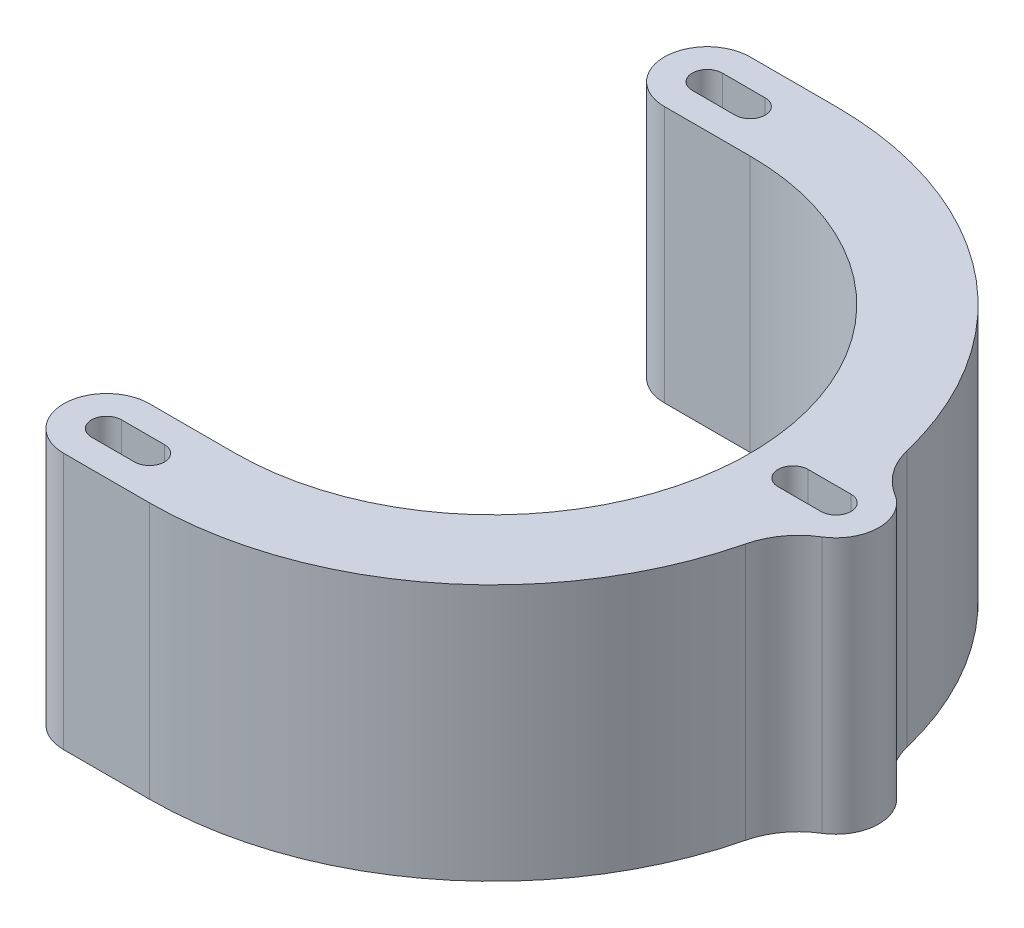
ISO-10303-21;
HEADER;
FILE_DESCRIPTION(('STEP AP214'),'2;1');
FILE_NAME('part.step','',(''),(''),'','','');
FILE_SCHEMA(('AUTOMOTIVE_DESIGN { 1 0 10303 214 1 1 1 1 }'));
ENDSEC;
DATA;
#1=APPLICATION_CONTEXT('core data for automotive mechanical design processes');
#2=APPLICATION_PROTOCOL_DEFINITION('international standard','automotive_design',2000,#1);
#3=PRODUCT_CONTEXT('',#1,'mechanical');
#4=PRODUCT('Part','Part','',(#3));
#5=PRODUCT_RELATED_PRODUCT_CATEGORY('part','',(#4));
#6=PRODUCT_DEFINITION_FORMATION('','',#4);
#7=PRODUCT_DEFINITION_CONTEXT('part definition',#1,'design');
#8=PRODUCT_DEFINITION('design','',#6,#7);
#9=PRODUCT_DEFINITION_SHAPE('','',#8);
#10=(LENGTH_UNIT() NAMED_UNIT(*) SI_UNIT(.MILLI.,.METRE.));
#11=(NAMED_UNIT(*) PLANE_ANGLE_UNIT() SI_UNIT($,.RADIAN.));
#12=(NAMED_UNIT(*) SI_UNIT($,.STERADIAN.) SOLID_ANGLE_UNIT());
#13=UNCERTAINTY_MEASURE_WITH_UNIT(LENGTH_MEASURE(1.E-05),#10,'distance_accuracy_value','');
#14=(GEOMETRIC_REPRESENTATION_CONTEXT(3) GLOBAL_UNCERTAINTY_ASSIGNED_CONTEXT((#13)) GLOBAL_UNIT_ASSIGNED_CONTEXT((#10,
#11,#12)) REPRESENTATION_CONTEXT('',''));
#15=CARTESIAN_POINT('',(0.,0.,0.));
#16=DIRECTION('',(0.,0.,1.));
#17=DIRECTION('',(1.,0.,0.));
#18=AXIS2_PLACEMENT_3D('',#15,#16,#17);
#19=CARTESIAN_POINT('',(56.375,35.9,13.6330251595161));
#20=DIRECTION('',(0.,-1.,0.));
#21=DIRECTION('',(0.,0.,-1.));
#22=AXIS2_PLACEMENT_3D('',#19,#20,#21);
#23=PLANE('',#22);
#24=CARTESIAN_POINT('',(48.,35.9,0.));
#25=DIRECTION('',(0.,1.,0.));
#26=DIRECTION('',(0.,0.,1.));
#27=AXIS2_PLACEMENT_3D('',#24,#25,#26);
#28=CIRCLE('',#27,2.1);
#29=CARTESIAN_POINT('',(48.,35.9,2.1));
#30=VERTEX_POINT('',#29);
#31=CARTESIAN_POINT('',(48.,35.9,-2.1));
#32=VERTEX_POINT('',#31);
#33=EDGE_CURVE('E232',#30,#32,#28,.T.);
#34=ORIENTED_EDGE('',*,*,#33,.F.);
#35=DIRECTION('',(1.,0.,0.));
#36=VECTOR('',#35,1.);
#37=CARTESIAN_POINT('',(48.,35.9,2.1));
#38=LINE('',#37,#36);
#39=CARTESIAN_POINT('',(42.,35.9,2.1));
#40=VERTEX_POINT('',#39);
#41=EDGE_CURVE('E240',#40,#30,#38,.T.);
#42=ORIENTED_EDGE('',*,*,#41,.F.);
#43=CARTESIAN_POINT('',(42.,35.9,0.));
#44=DIRECTION('',(0.,1.,0.));
#45=DIRECTION('',(0.,0.,1.));
#46=AXIS2_PLACEMENT_3D('',#43,#44,#45);
#47=CIRCLE('',#46,2.1);
#48=CARTESIAN_POINT('',(42.,35.9,-2.1));
#49=VERTEX_POINT('',#48);
#50=EDGE_CURVE('E237',#49,#40,#47,.T.);
#51=ORIENTED_EDGE('',*,*,#50,.F.);
#52=DIRECTION('',(-1.,0.,0.));
#53=VECTOR('',#52,1.);
#54=CARTESIAN_POINT('',(48.,35.9,-2.1));
#55=LINE('',#54,#53);
#56=EDGE_CURVE('E234',#32,#49,#55,.T.);
#57=ORIENTED_EDGE('',*,*,#56,.F.);
#58=EDGE_LOOP('',(#34,#42,#51,#57));
#59=FACE_BOUND('',#58,.T.);
#60=CARTESIAN_POINT('',(56.375,35.9,13.6330251595161));
#61=DIRECTION('',(0.,-1.,0.));
#62=DIRECTION('',(0.,0.,-1.));
#63=AXIS2_PLACEMENT_3D('',#60,#61,#62);
#64=CIRCLE('',#63,10.);
#65=CARTESIAN_POINT('',(46.6551724137931,35.9,11.2825035802892));
#66=VERTEX_POINT('',#65);
#67=CARTESIAN_POINT('',(51.140625,35.9,5.11238443481855));
#68=VERTEX_POINT('',#67);
#69=EDGE_CURVE('E294',#66,#68,#64,.T.);
#70=ORIENTED_EDGE('',*,*,#69,.T.);
#71=CARTESIAN_POINT('',(48.,35.9,0.));
#72=DIRECTION('',(0.,1.,0.));
#73=DIRECTION('',(0.,0.,1.));
#74=AXIS2_PLACEMENT_3D('',#71,#72,#73);
#75=CIRCLE('',#74,6.);
#76=CARTESIAN_POINT('',(51.140625,35.9,-5.11238443481856));
#77=VERTEX_POINT('',#76);
#78=EDGE_CURVE('E297',#68,#77,#75,.T.);
#79=ORIENTED_EDGE('',*,*,#78,.T.);
#80=CARTESIAN_POINT('',(56.375,35.9,-13.6330251595161));
#81=DIRECTION('',(0.,-1.,0.));
#82=DIRECTION('',(0.,0.,-1.));
#83=AXIS2_PLACEMENT_3D('',#80,#81,#82);
#84=CIRCLE('',#83,10.);
#85=CARTESIAN_POINT('',(46.6551724137931,35.9,-11.2825035802892));
#86=VERTEX_POINT('',#85);
#87=EDGE_CURVE('E300',#77,#86,#84,.T.);
#88=ORIENTED_EDGE('',*,*,#87,.T.);
#89=CARTESIAN_POINT('',(0.,35.9,0.));
#90=DIRECTION('',(0.,1.,0.));
#91=DIRECTION('',(0.,0.,1.));
#92=AXIS2_PLACEMENT_3D('',#89,#90,#91);
#93=CIRCLE('',#92,48.);
#94=CARTESIAN_POINT('',(0.,35.9,-48.));
#95=VERTEX_POINT('',#94);
#96=EDGE_CURVE('E302',#86,#95,#93,.T.);
#97=ORIENTED_EDGE('',*,*,#96,.T.);
#98=DIRECTION('',(-1.,0.,0.));
#99=VECTOR('',#98,1.);
#100=CARTESIAN_POINT('',(-12.,35.9,-48.));
#101=LINE('',#100,#99);
#102=CARTESIAN_POINT('',(-12.,35.9,-48.));
#103=VERTEX_POINT('',#102);
#104=EDGE_CURVE('E304',#95,#103,#101,.T.);
#105=ORIENTED_EDGE('',*,*,#104,.T.);
#106=CARTESIAN_POINT('',(-12.,35.9,-42.));
#107=DIRECTION('',(0.,1.,0.));
#108=DIRECTION('',(0.,0.,1.));
#109=AXIS2_PLACEMENT_3D('',#106,#107,#108);
#110=CIRCLE('',#109,6.);
#111=CARTESIAN_POINT('',(-12.,35.9,-36.));
#112=VERTEX_POINT('',#111);
#113=EDGE_CURVE('E306',#103,#112,#110,.T.);
#114=ORIENTED_EDGE('',*,*,#113,.T.);
#115=DIRECTION('',(1.,0.,0.));
#116=VECTOR('',#115,1.);
#117=CARTESIAN_POINT('',(-12.,35.9,-36.));
#118=LINE('',#117,#116);
#119=CARTESIAN_POINT('',(0.,35.9,-36.));
#120=VERTEX_POINT('',#119);
#121=EDGE_CURVE('E308',#112,#120,#118,.T.);
#122=ORIENTED_EDGE('',*,*,#121,.T.);
#123=CARTESIAN_POINT('',(0.,35.9,0.));
#124=DIRECTION('',(0.,-1.,0.));
#125=DIRECTION('',(0.,0.,1.));
#126=AXIS2_PLACEMENT_3D('',#123,#124,#125);
#127=CIRCLE('',#126,36.);
#128=CARTESIAN_POINT('',(0.,35.9,36.));
#129=VERTEX_POINT('',#128);
#130=EDGE_CURVE('E310',#120,#129,#127,.T.);
#131=ORIENTED_EDGE('',*,*,#130,.T.);
#132=DIRECTION('',(-1.,0.,0.));
#133=VECTOR('',#132,1.);
#134=CARTESIAN_POINT('',(-12.,35.9,36.));
#135=LINE('',#134,#133);
#136=CARTESIAN_POINT('',(-12.,35.9,36.));
#137=VERTEX_POINT('',#136);
#138=EDGE_CURVE('E312',#129,#137,#135,.T.);
#139=ORIENTED_EDGE('',*,*,#138,.T.);
#140=CARTESIAN_POINT('',(-12.,35.9,42.));
#141=DIRECTION('',(0.,1.,0.));
#142=DIRECTION('',(0.,0.,1.));
#143=AXIS2_PLACEMENT_3D('',#140,#141,#142);
#144=CIRCLE('',#143,6.);
#145=CARTESIAN_POINT('',(-12.,35.9,48.));
#146=VERTEX_POINT('',#145);
#147=EDGE_CURVE('E314',#137,#146,#144,.T.);
#148=ORIENTED_EDGE('',*,*,#147,.T.);
#149=DIRECTION('',(1.,0.,0.));
#150=VECTOR('',#149,1.);
#151=CARTESIAN_POINT('',(-12.,35.9,48.));
#152=LINE('',#151,#150);
#153=CARTESIAN_POINT('',(0.,35.9,48.));
#154=VERTEX_POINT('',#153);
#155=EDGE_CURVE('E316',#146,#154,#152,.T.);
#156=ORIENTED_EDGE('',*,*,#155,.T.);
#157=CARTESIAN_POINT('',(0.,35.9,0.));
#158=DIRECTION('',(0.,1.,0.));
#159=DIRECTION('',(0.,0.,1.));
#160=AXIS2_PLACEMENT_3D('',#157,#158,#159);
#161=CIRCLE('',#160,48.);
#162=EDGE_CURVE('E318',#154,#66,#161,.T.);
#163=ORIENTED_EDGE('',*,*,#162,.T.);
#164=EDGE_LOOP('',(#70,#79,#88,#97,#105,#114,#122,#131,#139,#148,#156,#163));
#165=FACE_BOUND('',#164,.T.);
#166=CARTESIAN_POINT('',(-12.,35.9,-42.));
#167=DIRECTION('',(0.,1.,0.));
#168=DIRECTION('',(0.,0.,1.));
#169=AXIS2_PLACEMENT_3D('',#166,#167,#168);
#170=CIRCLE('',#169,2.10000000000002);
#171=CARTESIAN_POINT('',(-12.,35.9,-44.1));
#172=VERTEX_POINT('',#171);
#173=CARTESIAN_POINT('',(-12.,35.9,-39.9));
#174=VERTEX_POINT('',#173);
#175=EDGE_CURVE('E263',#172,#174,#170,.T.);
#176=ORIENTED_EDGE('',*,*,#175,.F.);
#177=DIRECTION('',(-1.,0.,0.));
#178=VECTOR('',#177,1.);
#179=CARTESIAN_POINT('',(-12.,35.9,-44.1));
#180=LINE('',#179,#178);
#181=CARTESIAN_POINT('',(-6.,35.9,-44.1));
#182=VERTEX_POINT('',#181);
#183=EDGE_CURVE('E271',#182,#172,#180,.T.);
#184=ORIENTED_EDGE('',*,*,#183,.F.);
#185=CARTESIAN_POINT('',(-5.99999999999999,35.9,-42.));
#186=DIRECTION('',(0.,1.,0.));
#187=DIRECTION('',(0.,0.,1.));
#188=AXIS2_PLACEMENT_3D('',#185,#186,#187);
#189=CIRCLE('',#188,2.10000000000001);
#190=CARTESIAN_POINT('',(-5.99999999999999,35.9,-39.9));
#191=VERTEX_POINT('',#190);
#192=EDGE_CURVE('E268',#191,#182,#189,.T.);
#193=ORIENTED_EDGE('',*,*,#192,.F.);
#194=DIRECTION('',(1.,0.,0.));
#195=VECTOR('',#194,1.);
#196=CARTESIAN_POINT('',(-12.,35.9,-39.9));
#197=LINE('',#196,#195);
#198=EDGE_CURVE('E265',#174,#191,#197,.T.);
#199=ORIENTED_EDGE('',*,*,#198,.F.);
#200=EDGE_LOOP('',(#176,#184,#193,#199));
#201=FACE_BOUND('',#200,.T.);
#202=CARTESIAN_POINT('',(-12.,35.9,42.));
#203=DIRECTION('',(0.,1.,0.));
#204=DIRECTION('',(0.,0.,1.));
#205=AXIS2_PLACEMENT_3D('',#202,#203,#204);
#206=CIRCLE('',#205,2.1);
#207=CARTESIAN_POINT('',(-12.,35.9,39.9));
#208=VERTEX_POINT('',#207);
#209=CARTESIAN_POINT('',(-12.,35.9,44.1));
#210=VERTEX_POINT('',#209);
#211=EDGE_CURVE('E194',#208,#210,#206,.T.);
#212=ORIENTED_EDGE('',*,*,#211,.F.);
#213=DIRECTION('',(-1.,0.,0.));
#214=VECTOR('',#213,1.);
#215=CARTESIAN_POINT('',(-12.,35.9,39.9));
#216=LINE('',#215,#214);
#217=CARTESIAN_POINT('',(-6.,35.9,39.9));
#218=VERTEX_POINT('',#217);
#219=EDGE_CURVE('E216',#218,#208,#216,.T.);
#220=ORIENTED_EDGE('',*,*,#219,.F.);
#221=CARTESIAN_POINT('',(-5.99999999999999,35.9,42.));
#222=DIRECTION('',(0.,1.,0.));
#223=DIRECTION('',(0.,0.,1.));
#224=AXIS2_PLACEMENT_3D('',#221,#222,#223);
#225=CIRCLE('',#224,2.10000000000001);
#226=CARTESIAN_POINT('',(-5.99999999999999,35.9,44.1));
#227=VERTEX_POINT('',#226);
#228=EDGE_CURVE('E214',#227,#218,#225,.T.);
#229=ORIENTED_EDGE('',*,*,#228,.F.);
#230=DIRECTION('',(1.,0.,0.));
#231=VECTOR('',#230,1.);
#232=CARTESIAN_POINT('',(-12.,35.9,44.1));
#233=LINE('',#232,#231);
#234=EDGE_CURVE('E202',#210,#227,#233,.T.);
#235=ORIENTED_EDGE('',*,*,#234,.F.);
#236=EDGE_LOOP('',(#212,#220,#229,#235));
#237=FACE_BOUND('',#236,.T.);
#238=ADVANCED_FACE('F33',(#59,#165,#201,#237),#23,.F.);
#239=CARTESIAN_POINT('',(56.375,0.,13.6330251595161));
#240=DIRECTION('',(0.,-1.,0.));
#241=DIRECTION('',(0.,0.,-1.));
#242=AXIS2_PLACEMENT_3D('',#239,#240,#241);
#243=PLANE('',#242);
#244=CARTESIAN_POINT('',(29.6984848098349,0.,-29.6984848098351));
#245=DIRECTION('',(0.,1.,0.));
#246=DIRECTION('',(0.,0.,1.));
#247=AXIS2_PLACEMENT_3D('',#244,#245,#246);
#248=CIRCLE('',#247,1.25);
#249=CARTESIAN_POINT('',(29.6984848098349,0.,-28.448484809835));
#250=VERTEX_POINT('',#249);
#251=EDGE_CURVE('E705',#250,#250,#248,.T.);
#252=ORIENTED_EDGE('',*,*,#251,.T.);
#253=EDGE_LOOP('',(#252));
#254=FACE_BOUND('',#253,.T.);
#255=CARTESIAN_POINT('',(29.6984848098351,0.,29.6984848098349));
#256=DIRECTION('',(0.,1.,0.));
#257=DIRECTION('',(0.,0.,1.));
#258=AXIS2_PLACEMENT_3D('',#255,#256,#257);
#259=CIRCLE('',#258,1.25);
#260=CARTESIAN_POINT('',(29.6984848098351,0.,30.9484848098349));
#261=VERTEX_POINT('',#260);
#262=EDGE_CURVE('E712',#261,#261,#259,.T.);
#263=ORIENTED_EDGE('',*,*,#262,.T.);
#264=EDGE_LOOP('',(#263));
#265=FACE_BOUND('',#264,.T.);
#266=CARTESIAN_POINT('',(56.375,0.,13.6330251595161));
#267=DIRECTION('',(0.,-1.,0.));
#268=DIRECTION('',(0.,0.,-1.));
#269=AXIS2_PLACEMENT_3D('',#266,#267,#268);
#270=CIRCLE('',#269,10.);
#271=CARTESIAN_POINT('',(46.6551724137931,0.,11.2825035802892));
#272=VERTEX_POINT('',#271);
#273=CARTESIAN_POINT('',(51.140625,0.,5.11238443481855));
#274=VERTEX_POINT('',#273);
#275=EDGE_CURVE('E293',#272,#274,#270,.T.);
#276=ORIENTED_EDGE('',*,*,#275,.F.);
#277=CARTESIAN_POINT('',(0.,0.,0.));
#278=DIRECTION('',(0.,1.,0.));
#279=DIRECTION('',(0.,0.,1.));
#280=AXIS2_PLACEMENT_3D('',#277,#278,#279);
#281=CIRCLE('',#280,48.);
#282=CARTESIAN_POINT('',(0.,0.,48.));
#283=VERTEX_POINT('',#282);
#284=EDGE_CURVE('E298',#283,#272,#281,.T.);
#285=ORIENTED_EDGE('',*,*,#284,.F.);
#286=DIRECTION('',(1.,0.,0.));
#287=VECTOR('',#286,1.);
#288=CARTESIAN_POINT('',(-12.,0.,48.));
#289=LINE('',#288,#287);
#290=CARTESIAN_POINT('',(-12.,0.,48.));
#291=VERTEX_POINT('',#290);
#292=EDGE_CURVE('E341',#291,#283,#289,.T.);
#293=ORIENTED_EDGE('',*,*,#292,.F.);
#294=CARTESIAN_POINT('',(-12.,0.,42.));
#295=DIRECTION('',(0.,1.,0.));
#296=DIRECTION('',(0.,0.,1.));
#297=AXIS2_PLACEMENT_3D('',#294,#295,#296);
#298=CIRCLE('',#297,6.);
#299=CARTESIAN_POINT('',(-12.,0.,36.));
#300=VERTEX_POINT('',#299);
#301=EDGE_CURVE('E339',#300,#291,#298,.T.);
#302=ORIENTED_EDGE('',*,*,#301,.F.);
#303=DIRECTION('',(-1.,0.,0.));
#304=VECTOR('',#303,1.);
#305=CARTESIAN_POINT('',(-12.,0.,36.));
#306=LINE('',#305,#304);
#307=CARTESIAN_POINT('',(0.,0.,36.));
#308=VERTEX_POINT('',#307);
#309=EDGE_CURVE('E337',#308,#300,#306,.T.);
#310=ORIENTED_EDGE('',*,*,#309,.F.);
#311=CARTESIAN_POINT('',(0.,0.,0.));
#312=DIRECTION('',(0.,-1.,0.));
#313=DIRECTION('',(0.,0.,1.));
#314=AXIS2_PLACEMENT_3D('',#311,#312,#313);
#315=CIRCLE('',#314,36.);
#316=CARTESIAN_POINT('',(0.,0.,-36.));
#317=VERTEX_POINT('',#316);
#318=EDGE_CURVE('E335',#317,#308,#315,.T.);
#319=ORIENTED_EDGE('',*,*,#318,.F.);
#320=DIRECTION('',(1.,0.,0.));
#321=VECTOR('',#320,1.);
#322=CARTESIAN_POINT('',(-12.,0.,-36.));
#323=LINE('',#322,#321);
#324=CARTESIAN_POINT('',(-12.,0.,-36.));
#325=VERTEX_POINT('',#324);
#326=EDGE_CURVE('E333',#325,#317,#323,.T.);
#327=ORIENTED_EDGE('',*,*,#326,.F.);
#328=CARTESIAN_POINT('',(-12.,0.,-42.));
#329=DIRECTION('',(0.,1.,0.));
#330=DIRECTION('',(0.,0.,1.));
#331=AXIS2_PLACEMENT_3D('',#328,#329,#330);
#332=CIRCLE('',#331,6.);
#333=CARTESIAN_POINT('',(-12.,0.,-48.));
#334=VERTEX_POINT('',#333);
#335=EDGE_CURVE('E331',#334,#325,#332,.T.);
#336=ORIENTED_EDGE('',*,*,#335,.F.);
#337=DIRECTION('',(-1.,0.,0.));
#338=VECTOR('',#337,1.);
#339=CARTESIAN_POINT('',(-12.,0.,-48.));
#340=LINE('',#339,#338);
#341=CARTESIAN_POINT('',(0.,0.,-48.));
#342=VERTEX_POINT('',#341);
#343=EDGE_CURVE('E329',#342,#334,#340,.T.);
#344=ORIENTED_EDGE('',*,*,#343,.F.);
#345=CARTESIAN_POINT('',(0.,0.,0.));
#346=DIRECTION('',(0.,1.,0.));
#347=DIRECTION('',(0.,0.,1.));
#348=AXIS2_PLACEMENT_3D('',#345,#346,#347);
#349=CIRCLE('',#348,48.);
#350=CARTESIAN_POINT('',(46.6551724137931,0.,-11.2825035802892));
#351=VERTEX_POINT('',#350);
#352=EDGE_CURVE('E327',#351,#342,#349,.T.);
#353=ORIENTED_EDGE('',*,*,#352,.F.);
#354=CARTESIAN_POINT('',(56.375,0.,-13.6330251595161));
#355=DIRECTION('',(0.,-1.,0.));
#356=DIRECTION('',(0.,0.,-1.));
#357=AXIS2_PLACEMENT_3D('',#354,#355,#356);
#358=CIRCLE('',#357,10.);
#359=CARTESIAN_POINT('',(51.140625,0.,-5.11238443481856));
#360=VERTEX_POINT('',#359);
#361=EDGE_CURVE('E325',#360,#351,#358,.T.);
#362=ORIENTED_EDGE('',*,*,#361,.F.);
#363=CARTESIAN_POINT('',(48.,0.,0.));
#364=DIRECTION('',(0.,1.,0.));
#365=DIRECTION('',(0.,0.,1.));
#366=AXIS2_PLACEMENT_3D('',#363,#364,#365);
#367=CIRCLE('',#366,6.);
#368=EDGE_CURVE('E323',#274,#360,#367,.T.);
#369=ORIENTED_EDGE('',*,*,#368,.F.);
#370=EDGE_LOOP('',(#276,#285,#293,#302,#310,#319,#327,#336,#344,#353,#362,#369));
#371=FACE_BOUND('',#370,.T.);
#372=DIRECTION('',(-1.,0.,0.));
#373=VECTOR('',#372,1.);
#374=CARTESIAN_POINT('',(-12.,0.,-44.1));
#375=LINE('',#374,#373);
#376=CARTESIAN_POINT('',(-5.99999999999999,0.,-44.1));
#377=VERTEX_POINT('',#376);
#378=CARTESIAN_POINT('',(-12.,0.,-44.1));
#379=VERTEX_POINT('',#378);
#380=EDGE_CURVE('E266',#377,#379,#375,.T.);
#381=ORIENTED_EDGE('',*,*,#380,.T.);
#382=CARTESIAN_POINT('',(-12.,0.,-42.));
#383=DIRECTION('',(0.,1.,0.));
#384=DIRECTION('',(0.,0.,1.));
#385=AXIS2_PLACEMENT_3D('',#382,#383,#384);
#386=CIRCLE('',#385,2.10000000000002);
#387=CARTESIAN_POINT('',(-12.,0.,-39.9));
#388=VERTEX_POINT('',#387);
#389=EDGE_CURVE('E262',#379,#388,#386,.T.);
#390=ORIENTED_EDGE('',*,*,#389,.T.);
#391=DIRECTION('',(1.,0.,0.));
#392=VECTOR('',#391,1.);
#393=CARTESIAN_POINT('',(-12.,0.,-39.9));
#394=LINE('',#393,#392);
#395=CARTESIAN_POINT('',(-5.99999999999999,0.,-39.9));
#396=VERTEX_POINT('',#395);
#397=EDGE_CURVE('E276',#388,#396,#394,.T.);
#398=ORIENTED_EDGE('',*,*,#397,.T.);
#399=CARTESIAN_POINT('',(-5.99999999999999,0.,-42.));
#400=DIRECTION('',(0.,1.,0.));
#401=DIRECTION('',(0.,0.,1.));
#402=AXIS2_PLACEMENT_3D('',#399,#400,#401);
#403=CIRCLE('',#402,2.10000000000001);
#404=EDGE_CURVE('E279',#396,#377,#403,.T.);
#405=ORIENTED_EDGE('',*,*,#404,.T.);
#406=EDGE_LOOP('',(#381,#390,#398,#405));
#407=FACE_BOUND('',#406,.T.);
#408=DIRECTION('',(1.,0.,0.));
#409=VECTOR('',#408,1.);
#410=CARTESIAN_POINT('',(48.,0.,2.1));
#411=LINE('',#410,#409);
#412=CARTESIAN_POINT('',(42.,0.,2.1));
#413=VERTEX_POINT('',#412);
#414=CARTESIAN_POINT('',(48.,0.,2.1));
#415=VERTEX_POINT('',#414);
#416=EDGE_CURVE('E235',#413,#415,#411,.T.);
#417=ORIENTED_EDGE('',*,*,#416,.T.);
#418=CARTESIAN_POINT('',(48.,0.,0.));
#419=DIRECTION('',(0.,1.,0.));
#420=DIRECTION('',(0.,0.,1.));
#421=AXIS2_PLACEMENT_3D('',#418,#419,#420);
#422=CIRCLE('',#421,2.1);
#423=CARTESIAN_POINT('',(48.,0.,-2.1));
#424=VERTEX_POINT('',#423);
#425=EDGE_CURVE('E210',#415,#424,#422,.T.);
#426=ORIENTED_EDGE('',*,*,#425,.T.);
#427=DIRECTION('',(-1.,0.,0.));
#428=VECTOR('',#427,1.);
#429=CARTESIAN_POINT('',(48.,0.,-2.1));
#430=LINE('',#429,#428);
#431=CARTESIAN_POINT('',(42.,0.,-2.1));
#432=VERTEX_POINT('',#431);
#433=EDGE_CURVE('E245',#424,#432,#430,.T.);
#434=ORIENTED_EDGE('',*,*,#433,.T.);
#435=CARTESIAN_POINT('',(42.,0.,0.));
#436=DIRECTION('',(0.,1.,0.));
#437=DIRECTION('',(0.,0.,1.));
#438=AXIS2_PLACEMENT_3D('',#435,#436,#437);
#439=CIRCLE('',#438,2.1);
#440=EDGE_CURVE('E248',#432,#413,#439,.T.);
#441=ORIENTED_EDGE('',*,*,#440,.T.);
#442=EDGE_LOOP('',(#417,#426,#434,#441));
#443=FACE_BOUND('',#442,.T.);
#444=DIRECTION('',(-1.,0.,0.));
#445=VECTOR('',#444,1.);
#446=CARTESIAN_POINT('',(-12.,0.,39.9));
#447=LINE('',#446,#445);
#448=CARTESIAN_POINT('',(-5.99999999999999,0.,39.9));
#449=VERTEX_POINT('',#448);
#450=CARTESIAN_POINT('',(-12.,0.,39.9));
#451=VERTEX_POINT('',#450);
#452=EDGE_CURVE('E203',#449,#451,#447,.T.);
#453=ORIENTED_EDGE('',*,*,#452,.T.);
#454=CARTESIAN_POINT('',(-12.,0.,42.));
#455=DIRECTION('',(0.,1.,0.));
#456=DIRECTION('',(0.,0.,1.));
#457=AXIS2_PLACEMENT_3D('',#454,#455,#456);
#458=CIRCLE('',#457,2.1);
#459=CARTESIAN_POINT('',(-12.,0.,44.1));
#460=VERTEX_POINT('',#459);
#461=EDGE_CURVE('E56',#451,#460,#458,.T.);
#462=ORIENTED_EDGE('',*,*,#461,.T.);
#463=DIRECTION('',(1.,0.,0.));
#464=VECTOR('',#463,1.);
#465=CARTESIAN_POINT('',(-12.,0.,44.1));
#466=LINE('',#465,#464);
#467=CARTESIAN_POINT('',(-5.99999999999999,0.,44.1));
#468=VERTEX_POINT('',#467);
#469=EDGE_CURVE('E209',#460,#468,#466,.T.);
#470=ORIENTED_EDGE('',*,*,#469,.T.);
#471=CARTESIAN_POINT('',(-5.99999999999999,0.,42.));
#472=DIRECTION('',(0.,1.,0.));
#473=DIRECTION('',(0.,0.,1.));
#474=AXIS2_PLACEMENT_3D('',#471,#472,#473);
#475=CIRCLE('',#474,2.10000000000001);
#476=EDGE_CURVE('E224',#468,#449,#475,.T.);
#477=ORIENTED_EDGE('',*,*,#476,.T.);
#478=EDGE_LOOP('',(#453,#462,#470,#477));
#479=FACE_BOUND('',#478,.T.);
#480=ADVANCED_FACE('F383',(#254,#265,#371,#407,#443,#479),#243,.T.);
#481=CARTESIAN_POINT('',(56.375,35.9,13.6330251595161));
#482=DIRECTION('',(0.,-1.,0.));
#483=DIRECTION('',(0.,0.,-1.));
#484=AXIS2_PLACEMENT_3D('',#481,#482,#483);
#485=CYLINDRICAL_SURFACE('',#484,10.);
#486=ORIENTED_EDGE('',*,*,#275,.T.);
#487=DIRECTION('',(0.,-1.,0.));
#488=VECTOR('',#487,1.);
#489=CARTESIAN_POINT('',(51.140625,35.9,5.11238443481855));
#490=LINE('',#489,#488);
#491=EDGE_CURVE('E11',#68,#274,#490,.T.);
#492=ORIENTED_EDGE('',*,*,#491,.F.);
#493=ORIENTED_EDGE('',*,*,#69,.F.);
#494=DIRECTION('',(0.,-1.,0.));
#495=VECTOR('',#494,1.);
#496=CARTESIAN_POINT('',(46.6551724137931,35.9,11.2825035802892));
#497=LINE('',#496,#495);
#498=EDGE_CURVE('E320',#66,#272,#497,.T.);
#499=ORIENTED_EDGE('',*,*,#498,.T.);
#500=EDGE_LOOP('',(#486,#492,#493,#499));
#501=FACE_BOUND('',#500,.T.);
#502=ADVANCED_FACE('F35',(#501),#485,.F.);
#503=CARTESIAN_POINT('',(48.,35.9,0.));
#504=DIRECTION('',(0.,-1.,0.));
#505=DIRECTION('',(0.,0.,-1.));
#506=AXIS2_PLACEMENT_3D('',#503,#504,#505);
#507=CYLINDRICAL_SURFACE('',#506,6.);
#508=ORIENTED_EDGE('',*,*,#368,.T.);
#509=DIRECTION('',(0.,-1.,0.));
#510=VECTOR('',#509,1.);
#511=CARTESIAN_POINT('',(51.140625,35.9,-5.11238443481856));
#512=LINE('',#511,#510);
#513=EDGE_CURVE('E41',#77,#360,#512,.T.);
#514=ORIENTED_EDGE('',*,*,#513,.F.);
#515=ORIENTED_EDGE('',*,*,#78,.F.);
#516=ORIENTED_EDGE('',*,*,#491,.T.);
#517=EDGE_LOOP('',(#508,#514,#515,#516));
#518=FACE_BOUND('',#517,.T.);
#519=ADVANCED_FACE('F401',(#518),#507,.T.);
#520=CARTESIAN_POINT('',(56.375,35.9,-13.6330251595161));
#521=DIRECTION('',(0.,-1.,0.));
#522=DIRECTION('',(0.,0.,-1.));
#523=AXIS2_PLACEMENT_3D('',#520,#521,#522);
#524=CYLINDRICAL_SURFACE('',#523,10.);
#525=ORIENTED_EDGE('',*,*,#361,.T.);
#526=DIRECTION('',(0.,-1.,0.));
#527=VECTOR('',#526,1.);
#528=CARTESIAN_POINT('',(46.6551724137931,35.9,-11.2825035802892));
#529=LINE('',#528,#527);
#530=EDGE_CURVE('E370',#86,#351,#529,.T.);
#531=ORIENTED_EDGE('',*,*,#530,.F.);
#532=ORIENTED_EDGE('',*,*,#87,.F.);
#533=ORIENTED_EDGE('',*,*,#513,.T.);
#534=EDGE_LOOP('',(#525,#531,#532,#533));
#535=FACE_BOUND('',#534,.T.);
#536=ADVANCED_FACE('F377',(#535),#524,.F.);
#537=CARTESIAN_POINT('',(0.,35.9,0.));
#538=DIRECTION('',(0.,-1.,0.));
#539=DIRECTION('',(0.,0.,-1.));
#540=AXIS2_PLACEMENT_3D('',#537,#538,#539);
#541=CYLINDRICAL_SURFACE('',#540,48.);
#542=ORIENTED_EDGE('',*,*,#352,.T.);
#543=DIRECTION('',(0.,-1.,0.));
#544=VECTOR('',#543,1.);
#545=CARTESIAN_POINT('',(0.,35.9,-48.));
#546=LINE('',#545,#544);
#547=EDGE_CURVE('E367',#95,#342,#546,.T.);
#548=ORIENTED_EDGE('',*,*,#547,.F.);
#549=ORIENTED_EDGE('',*,*,#96,.F.);
#550=ORIENTED_EDGE('',*,*,#530,.T.);
#551=EDGE_LOOP('',(#542,#548,#549,#550));
#552=FACE_BOUND('',#551,.T.);
#553=ADVANCED_FACE('F389',(#552),#541,.T.);
#554=CARTESIAN_POINT('',(-12.,35.9,-48.));
#555=DIRECTION('',(0.,0.,1.));
#556=DIRECTION('',(1.,0.,0.));
#557=AXIS2_PLACEMENT_3D('',#554,#555,#556);
#558=PLANE('',#557);
#559=ORIENTED_EDGE('',*,*,#343,.T.);
#560=DIRECTION('',(0.,-1.,0.));
#561=VECTOR('',#560,1.);
#562=CARTESIAN_POINT('',(-12.,35.9,-48.));
#563=LINE('',#562,#561);
#564=EDGE_CURVE('E364',#103,#334,#563,.T.);
#565=ORIENTED_EDGE('',*,*,#564,.F.);
#566=ORIENTED_EDGE('',*,*,#104,.F.);
#567=ORIENTED_EDGE('',*,*,#547,.T.);
#568=EDGE_LOOP('',(#559,#565,#566,#567));
#569=FACE_BOUND('',#568,.T.);
#570=ADVANCED_FACE('F393',(#569),#558,.F.);
#571=CARTESIAN_POINT('',(-12.,35.9,-42.));
#572=DIRECTION('',(0.,-1.,0.));
#573=DIRECTION('',(0.,0.,-1.));
#574=AXIS2_PLACEMENT_3D('',#571,#572,#573);
#575=CYLINDRICAL_SURFACE('',#574,6.);
#576=ORIENTED_EDGE('',*,*,#335,.T.);
#577=DIRECTION('',(0.,-1.,0.));
#578=VECTOR('',#577,1.);
#579=CARTESIAN_POINT('',(-12.,35.9,-36.));
#580=LINE('',#579,#578);
#581=EDGE_CURVE('E361',#112,#325,#580,.T.);
#582=ORIENTED_EDGE('',*,*,#581,.F.);
#583=ORIENTED_EDGE('',*,*,#113,.F.);
#584=ORIENTED_EDGE('',*,*,#564,.T.);
#585=EDGE_LOOP('',(#576,#582,#583,#584));
#586=FACE_BOUND('',#585,.T.);
#587=ADVANCED_FACE('F434',(#586),#575,.T.);
#588=CARTESIAN_POINT('',(-12.,35.9,-36.));
#589=DIRECTION('',(0.,0.,-1.));
#590=DIRECTION('',(-1.,0.,0.));
#591=AXIS2_PLACEMENT_3D('',#588,#589,#590);
#592=PLANE('',#591);
#593=ORIENTED_EDGE('',*,*,#326,.T.);
#594=DIRECTION('',(0.,-1.,0.));
#595=VECTOR('',#594,1.);
#596=CARTESIAN_POINT('',(0.,35.9,-36.));
#597=LINE('',#596,#595);
#598=EDGE_CURVE('E358',#120,#317,#597,.T.);
#599=ORIENTED_EDGE('',*,*,#598,.F.);
#600=ORIENTED_EDGE('',*,*,#121,.F.);
#601=ORIENTED_EDGE('',*,*,#581,.T.);
#602=EDGE_LOOP('',(#593,#599,#600,#601));
#603=FACE_BOUND('',#602,.T.);
#604=ADVANCED_FACE('F432',(#603),#592,.F.);
#605=CARTESIAN_POINT('',(0.,35.9,0.));
#606=DIRECTION('',(0.,-1.,0.));
#607=DIRECTION('',(0.,0.,-1.));
#608=AXIS2_PLACEMENT_3D('',#605,#606,#607);
#609=CYLINDRICAL_SURFACE('',#608,36.);
#610=ORIENTED_EDGE('',*,*,#318,.T.);
#611=DIRECTION('',(0.,-1.,0.));
#612=VECTOR('',#611,1.);
#613=CARTESIAN_POINT('',(0.,35.9,36.));
#614=LINE('',#613,#612);
#615=EDGE_CURVE('E355',#129,#308,#614,.T.);
#616=ORIENTED_EDGE('',*,*,#615,.F.);
#617=ORIENTED_EDGE('',*,*,#130,.F.);
#618=ORIENTED_EDGE('',*,*,#598,.T.);
#619=EDGE_LOOP('',(#610,#616,#617,#618));
#620=FACE_BOUND('',#619,.T.);
#621=ADVANCED_FACE('F428',(#620),#609,.F.);
#622=CARTESIAN_POINT('',(-12.,35.9,36.));
#623=DIRECTION('',(0.,0.,1.));
#624=DIRECTION('',(1.,0.,0.));
#625=AXIS2_PLACEMENT_3D('',#622,#623,#624);
#626=PLANE('',#625);
#627=ORIENTED_EDGE('',*,*,#309,.T.);
#628=DIRECTION('',(0.,-1.,0.));
#629=VECTOR('',#628,1.);
#630=CARTESIAN_POINT('',(-12.,35.9,36.));
#631=LINE('',#630,#629);
#632=EDGE_CURVE('E352',#137,#300,#631,.T.);
#633=ORIENTED_EDGE('',*,*,#632,.F.);
#634=ORIENTED_EDGE('',*,*,#138,.F.);
#635=ORIENTED_EDGE('',*,*,#615,.T.);
#636=EDGE_LOOP('',(#627,#633,#634,#635));
#637=FACE_BOUND('',#636,.T.);
#638=ADVANCED_FACE('F423',(#637),#626,.F.);
#639=CARTESIAN_POINT('',(-12.,35.9,42.));
#640=DIRECTION('',(0.,-1.,0.));
#641=DIRECTION('',(0.,0.,-1.));
#642=AXIS2_PLACEMENT_3D('',#639,#640,#641);
#643=CYLINDRICAL_SURFACE('',#642,6.);
#644=ORIENTED_EDGE('',*,*,#301,.T.);
#645=DIRECTION('',(0.,-1.,0.));
#646=VECTOR('',#645,1.);
#647=CARTESIAN_POINT('',(-12.,35.9,48.));
#648=LINE('',#647,#646);
#649=EDGE_CURVE('E349',#146,#291,#648,.T.);
#650=ORIENTED_EDGE('',*,*,#649,.F.);
#651=ORIENTED_EDGE('',*,*,#147,.F.);
#652=ORIENTED_EDGE('',*,*,#632,.T.);
#653=EDGE_LOOP('',(#644,#650,#651,#652));
#654=FACE_BOUND('',#653,.T.);
#655=ADVANCED_FACE('F417',(#654),#643,.T.);
#656=CARTESIAN_POINT('',(-12.,35.9,48.));
#657=DIRECTION('',(0.,0.,-1.));
#658=DIRECTION('',(-1.,0.,0.));
#659=AXIS2_PLACEMENT_3D('',#656,#657,#658);
#660=PLANE('',#659);
#661=ORIENTED_EDGE('',*,*,#292,.T.);
#662=DIRECTION('',(0.,-1.,0.));
#663=VECTOR('',#662,1.);
#664=CARTESIAN_POINT('',(0.,35.9,48.));
#665=LINE('',#664,#663);
#666=EDGE_CURVE('E346',#154,#283,#665,.T.);
#667=ORIENTED_EDGE('',*,*,#666,.F.);
#668=ORIENTED_EDGE('',*,*,#155,.F.);
#669=ORIENTED_EDGE('',*,*,#649,.T.);
#670=EDGE_LOOP('',(#661,#667,#668,#669));
#671=FACE_BOUND('',#670,.T.);
#672=ADVANCED_FACE('F413',(#671),#660,.F.);
#673=CARTESIAN_POINT('',(0.,35.9,0.));
#674=DIRECTION('',(0.,-1.,0.));
#675=DIRECTION('',(0.,0.,-1.));
#676=AXIS2_PLACEMENT_3D('',#673,#674,#675);
#677=CYLINDRICAL_SURFACE('',#676,48.);
#678=ORIENTED_EDGE('',*,*,#284,.T.);
#679=ORIENTED_EDGE('',*,*,#498,.F.);
#680=ORIENTED_EDGE('',*,*,#162,.F.);
#681=ORIENTED_EDGE('',*,*,#666,.T.);
#682=EDGE_LOOP('',(#678,#679,#680,#681));
#683=FACE_BOUND('',#682,.T.);
#684=ADVANCED_FACE('F408',(#683),#677,.T.);
#685=CARTESIAN_POINT('',(-12.,35.9,-42.));
#686=DIRECTION('',(0.,-1.,0.));
#687=DIRECTION('',(0.,0.,-1.));
#688=AXIS2_PLACEMENT_3D('',#685,#686,#687);
#689=CYLINDRICAL_SURFACE('',#688,2.10000000000002);
#690=ORIENTED_EDGE('',*,*,#389,.F.);
#691=DIRECTION('',(0.,-1.,0.));
#692=VECTOR('',#691,1.);
#693=CARTESIAN_POINT('',(-12.,35.9,-44.1));
#694=LINE('',#693,#692);
#695=EDGE_CURVE('E273',#172,#379,#694,.T.);
#696=ORIENTED_EDGE('',*,*,#695,.F.);
#697=ORIENTED_EDGE('',*,*,#175,.T.);
#698=DIRECTION('',(0.,-1.,0.));
#699=VECTOR('',#698,1.);
#700=CARTESIAN_POINT('',(-12.,35.9,-39.9));
#701=LINE('',#700,#699);
#702=EDGE_CURVE('E290',#174,#388,#701,.T.);
#703=ORIENTED_EDGE('',*,*,#702,.T.);
#704=EDGE_LOOP('',(#690,#696,#697,#703));
#705=FACE_BOUND('',#704,.T.);
#706=ADVANCED_FACE('F453',(#705),#689,.F.);
#707=CARTESIAN_POINT('',(-12.,35.9,-39.9));
#708=DIRECTION('',(0.,0.,-1.));
#709=DIRECTION('',(-1.,0.,0.));
#710=AXIS2_PLACEMENT_3D('',#707,#708,#709);
#711=PLANE('',#710);
#712=ORIENTED_EDGE('',*,*,#397,.F.);
#713=ORIENTED_EDGE('',*,*,#702,.F.);
#714=ORIENTED_EDGE('',*,*,#198,.T.);
#715=DIRECTION('',(0.,-1.,0.));
#716=VECTOR('',#715,1.);
#717=CARTESIAN_POINT('',(-5.99999999999999,35.9,-39.9));
#718=LINE('',#717,#716);
#719=EDGE_CURVE('E288',#191,#396,#718,.T.);
#720=ORIENTED_EDGE('',*,*,#719,.T.);
#721=EDGE_LOOP('',(#712,#713,#714,#720));
#722=FACE_BOUND('',#721,.T.);
#723=ADVANCED_FACE('F491',(#722),#711,.T.);
#724=CARTESIAN_POINT('',(-5.99999999999999,35.9,-42.));
#725=DIRECTION('',(0.,-1.,0.));
#726=DIRECTION('',(0.,0.,-1.));
#727=AXIS2_PLACEMENT_3D('',#724,#725,#726);
#728=CYLINDRICAL_SURFACE('',#727,2.10000000000001);
#729=ORIENTED_EDGE('',*,*,#404,.F.);
#730=ORIENTED_EDGE('',*,*,#719,.F.);
#731=ORIENTED_EDGE('',*,*,#192,.T.);
#732=DIRECTION('',(0.,-1.,0.));
#733=VECTOR('',#732,1.);
#734=CARTESIAN_POINT('',(-5.99999999999999,35.9,-44.1));
#735=LINE('',#734,#733);
#736=EDGE_CURVE('E286',#182,#377,#735,.T.);
#737=ORIENTED_EDGE('',*,*,#736,.T.);
#738=EDGE_LOOP('',(#729,#730,#731,#737));
#739=FACE_BOUND('',#738,.T.);
#740=ADVANCED_FACE('F498',(#739),#728,.F.);
#741=CARTESIAN_POINT('',(-12.,35.9,-44.1));
#742=DIRECTION('',(0.,0.,1.));
#743=DIRECTION('',(1.,0.,0.));
#744=AXIS2_PLACEMENT_3D('',#741,#742,#743);
#745=PLANE('',#744);
#746=ORIENTED_EDGE('',*,*,#380,.F.);
#747=ORIENTED_EDGE('',*,*,#736,.F.);
#748=ORIENTED_EDGE('',*,*,#183,.T.);
#749=ORIENTED_EDGE('',*,*,#695,.T.);
#750=EDGE_LOOP('',(#746,#747,#748,#749));
#751=FACE_BOUND('',#750,.T.);
#752=ADVANCED_FACE('F505',(#751),#745,.T.);
#753=CARTESIAN_POINT('',(48.,35.9,0.));
#754=DIRECTION('',(0.,-1.,0.));
#755=DIRECTION('',(0.,0.,-1.));
#756=AXIS2_PLACEMENT_3D('',#753,#754,#755);
#757=CYLINDRICAL_SURFACE('',#756,2.1);
#758=ORIENTED_EDGE('',*,*,#425,.F.);
#759=DIRECTION('',(0.,-1.,0.));
#760=VECTOR('',#759,1.);
#761=CARTESIAN_POINT('',(48.,35.9,2.1));
#762=LINE('',#761,#760);
#763=EDGE_CURVE('E242',#30,#415,#762,.T.);
#764=ORIENTED_EDGE('',*,*,#763,.F.);
#765=ORIENTED_EDGE('',*,*,#33,.T.);
#766=DIRECTION('',(0.,-1.,0.));
#767=VECTOR('',#766,1.);
#768=CARTESIAN_POINT('',(48.,35.9,-2.1));
#769=LINE('',#768,#767);
#770=EDGE_CURVE('E259',#32,#424,#769,.T.);
#771=ORIENTED_EDGE('',*,*,#770,.T.);
#772=EDGE_LOOP('',(#758,#764,#765,#771));
#773=FACE_BOUND('',#772,.T.);
#774=ADVANCED_FACE('F513',(#773),#757,.F.);
#775=CARTESIAN_POINT('',(48.,35.9,-2.1));
#776=DIRECTION('',(0.,0.,1.));
#777=DIRECTION('',(1.,0.,0.));
#778=AXIS2_PLACEMENT_3D('',#775,#776,#777);
#779=PLANE('',#778);
#780=ORIENTED_EDGE('',*,*,#433,.F.);
#781=ORIENTED_EDGE('',*,*,#770,.F.);
#782=ORIENTED_EDGE('',*,*,#56,.T.);
#783=DIRECTION('',(0.,-1.,0.));
#784=VECTOR('',#783,1.);
#785=CARTESIAN_POINT('',(42.,35.9,-2.1));
#786=LINE('',#785,#784);
#787=EDGE_CURVE('E257',#49,#432,#786,.T.);
#788=ORIENTED_EDGE('',*,*,#787,.T.);
#789=EDGE_LOOP('',(#780,#781,#782,#788));
#790=FACE_BOUND('',#789,.T.);
#791=ADVANCED_FACE('F521',(#790),#779,.T.);
#792=CARTESIAN_POINT('',(42.,35.9,0.));
#793=DIRECTION('',(0.,-1.,0.));
#794=DIRECTION('',(0.,0.,-1.));
#795=AXIS2_PLACEMENT_3D('',#792,#793,#794);
#796=CYLINDRICAL_SURFACE('',#795,2.1);
#797=ORIENTED_EDGE('',*,*,#440,.F.);
#798=ORIENTED_EDGE('',*,*,#787,.F.);
#799=ORIENTED_EDGE('',*,*,#50,.T.);
#800=DIRECTION('',(0.,-1.,0.));
#801=VECTOR('',#800,1.);
#802=CARTESIAN_POINT('',(42.,35.9,2.1));
#803=LINE('',#802,#801);
#804=EDGE_CURVE('E255',#40,#413,#803,.T.);
#805=ORIENTED_EDGE('',*,*,#804,.T.);
#806=EDGE_LOOP('',(#797,#798,#799,#805));
#807=FACE_BOUND('',#806,.T.);
#808=ADVANCED_FACE('F529',(#807),#796,.F.);
#809=CARTESIAN_POINT('',(48.,35.9,2.1));
#810=DIRECTION('',(0.,0.,-1.));
#811=DIRECTION('',(-1.,0.,0.));
#812=AXIS2_PLACEMENT_3D('',#809,#810,#811);
#813=PLANE('',#812);
#814=ORIENTED_EDGE('',*,*,#416,.F.);
#815=ORIENTED_EDGE('',*,*,#804,.F.);
#816=ORIENTED_EDGE('',*,*,#41,.T.);
#817=ORIENTED_EDGE('',*,*,#763,.T.);
#818=EDGE_LOOP('',(#814,#815,#816,#817));
#819=FACE_BOUND('',#818,.T.);
#820=ADVANCED_FACE('F537',(#819),#813,.T.);
#821=CARTESIAN_POINT('',(-12.,35.9,42.));
#822=DIRECTION('',(0.,-1.,0.));
#823=DIRECTION('',(0.,0.,-1.));
#824=AXIS2_PLACEMENT_3D('',#821,#822,#823);
#825=CYLINDRICAL_SURFACE('',#824,2.1);
#826=ORIENTED_EDGE('',*,*,#461,.F.);
#827=DIRECTION('',(0.,-1.,0.));
#828=VECTOR('',#827,1.);
#829=CARTESIAN_POINT('',(-12.,35.9,39.9));
#830=LINE('',#829,#828);
#831=EDGE_CURVE('E198',#208,#451,#830,.T.);
#832=ORIENTED_EDGE('',*,*,#831,.F.);
#833=ORIENTED_EDGE('',*,*,#211,.T.);
#834=DIRECTION('',(0.,-1.,0.));
#835=VECTOR('',#834,1.);
#836=CARTESIAN_POINT('',(-12.,35.9,44.1));
#837=LINE('',#836,#835);
#838=EDGE_CURVE('E197',#210,#460,#837,.T.);
#839=ORIENTED_EDGE('',*,*,#838,.T.);
#840=EDGE_LOOP('',(#826,#832,#833,#839));
#841=FACE_BOUND('',#840,.T.);
#842=ADVANCED_FACE('F196',(#841),#825,.F.);
#843=CARTESIAN_POINT('',(-12.,35.9,44.1));
#844=DIRECTION('',(0.,0.,-1.));
#845=DIRECTION('',(-1.,0.,0.));
#846=AXIS2_PLACEMENT_3D('',#843,#844,#845);
#847=PLANE('',#846);
#848=ORIENTED_EDGE('',*,*,#469,.F.);
#849=ORIENTED_EDGE('',*,*,#838,.F.);
#850=ORIENTED_EDGE('',*,*,#234,.T.);
#851=DIRECTION('',(0.,-1.,0.));
#852=VECTOR('',#851,1.);
#853=CARTESIAN_POINT('',(-5.99999999999999,35.9,44.1));
#854=LINE('',#853,#852);
#855=EDGE_CURVE('E211',#227,#468,#854,.T.);
#856=ORIENTED_EDGE('',*,*,#855,.T.);
#857=EDGE_LOOP('',(#848,#849,#850,#856));
#858=FACE_BOUND('',#857,.T.);
#859=ADVANCED_FACE('F206',(#858),#847,.T.);
#860=CARTESIAN_POINT('',(-5.99999999999999,35.9,42.));
#861=DIRECTION('',(0.,-1.,0.));
#862=DIRECTION('',(0.,0.,-1.));
#863=AXIS2_PLACEMENT_3D('',#860,#861,#862);
#864=CYLINDRICAL_SURFACE('',#863,2.10000000000001);
#865=ORIENTED_EDGE('',*,*,#476,.F.);
#866=ORIENTED_EDGE('',*,*,#855,.F.);
#867=ORIENTED_EDGE('',*,*,#228,.T.);
#868=DIRECTION('',(0.,-1.,0.));
#869=VECTOR('',#868,1.);
#870=CARTESIAN_POINT('',(-5.99999999999999,35.9,39.9));
#871=LINE('',#870,#869);
#872=EDGE_CURVE('E48',#218,#449,#871,.T.);
#873=ORIENTED_EDGE('',*,*,#872,.T.);
#874=EDGE_LOOP('',(#865,#866,#867,#873));
#875=FACE_BOUND('',#874,.T.);
#876=ADVANCED_FACE('F558',(#875),#864,.F.);
#877=CARTESIAN_POINT('',(-12.,35.9,39.9));
#878=DIRECTION('',(0.,0.,1.));
#879=DIRECTION('',(1.,0.,0.));
#880=AXIS2_PLACEMENT_3D('',#877,#878,#879);
#881=PLANE('',#880);
#882=ORIENTED_EDGE('',*,*,#452,.F.);
#883=ORIENTED_EDGE('',*,*,#872,.F.);
#884=ORIENTED_EDGE('',*,*,#219,.T.);
#885=ORIENTED_EDGE('',*,*,#831,.T.);
#886=EDGE_LOOP('',(#882,#883,#884,#885));
#887=FACE_BOUND('',#886,.T.);
#888=ADVANCED_FACE('F565',(#887),#881,.T.);
#889=CARTESIAN_POINT('',(29.6984848098351,10.,29.6984848098349));
#890=DIRECTION('',(0.,-1.,0.));
#891=DIRECTION('',(0.,0.,-1.));
#892=AXIS2_PLACEMENT_3D('',#889,#890,#891);
#893=CYLINDRICAL_SURFACE('',#892,1.25);
#894=CARTESIAN_POINT('',(29.6984848098351,10.,29.6984848098349));
#895=DIRECTION('',(0.,1.,0.));
#896=DIRECTION('',(0.,0.,1.));
#897=AXIS2_PLACEMENT_3D('',#894,#895,#896);
#898=CIRCLE('',#897,1.25);
#899=CARTESIAN_POINT('',(29.6984848098351,10.,30.9484848098349));
#900=VERTEX_POINT('',#899);
#901=EDGE_CURVE('E708',#900,#900,#898,.T.);
#902=ORIENTED_EDGE('',*,*,#901,.T.);
#903=EDGE_LOOP('',(#902));
#904=FACE_BOUND('',#903,.T.);
#905=ORIENTED_EDGE('',*,*,#262,.F.);
#906=EDGE_LOOP('',(#905));
#907=FACE_BOUND('',#906,.T.);
#908=ADVANCED_FACE('F573',(#904,#907),#893,.F.);
#909=CARTESIAN_POINT('',(29.6984848098351,10.,29.6984848098349));
#910=DIRECTION('',(0.,1.,0.));
#911=DIRECTION('',(0.,0.,1.));
#912=AXIS2_PLACEMENT_3D('',#909,#910,#911);
#913=PLANE('',#912);
#914=ORIENTED_EDGE('',*,*,#901,.F.);
#915=EDGE_LOOP('',(#914));
#916=FACE_BOUND('',#915,.T.);
#917=ADVANCED_FACE('F581',(#916),#913,.F.);
#918=CARTESIAN_POINT('',(29.6984848098349,10.,-29.6984848098351));
#919=DIRECTION('',(0.,-1.,0.));
#920=DIRECTION('',(0.,0.,-1.));
#921=AXIS2_PLACEMENT_3D('',#918,#919,#920);
#922=CYLINDRICAL_SURFACE('',#921,1.25);
#923=CARTESIAN_POINT('',(29.6984848098349,10.,-29.6984848098351));
#924=DIRECTION('',(0.,1.,0.));
#925=DIRECTION('',(0.,0.,1.));
#926=AXIS2_PLACEMENT_3D('',#923,#924,#925);
#927=CIRCLE('',#926,1.25);
#928=CARTESIAN_POINT('',(29.6984848098349,10.,-28.448484809835));
#929=VERTEX_POINT('',#928);
#930=EDGE_CURVE('E222',#929,#929,#927,.T.);
#931=ORIENTED_EDGE('',*,*,#930,.T.);
#932=EDGE_LOOP('',(#931));
#933=FACE_BOUND('',#932,.T.);
#934=ORIENTED_EDGE('',*,*,#251,.F.);
#935=EDGE_LOOP('',(#934));
#936=FACE_BOUND('',#935,.T.);
#937=ADVANCED_FACE('F589',(#933,#936),#922,.F.);
#938=CARTESIAN_POINT('',(29.6984848098349,10.,-29.6984848098351));
#939=DIRECTION('',(0.,1.,0.));
#940=DIRECTION('',(0.,0.,1.));
#941=AXIS2_PLACEMENT_3D('',#938,#939,#940);
#942=PLANE('',#941);
#943=ORIENTED_EDGE('',*,*,#930,.F.);
#944=EDGE_LOOP('',(#943));
#945=FACE_BOUND('',#944,.T.);
#946=ADVANCED_FACE('F597',(#945),#942,.F.);
#947=CLOSED_SHELL('',(#238,#480,#502,#519,#536,#553,#570,#587,#604,#621,#638,#655,#672,#684,
#706,#723,#740,#752,#774,#791,#808,#820,#842,#859,#876,#888,#908,#917,#937,#946));
#948=MANIFOLD_SOLID_BREP('B2',#947);
#949=ADVANCED_BREP_SHAPE_REPRESENTATION('',(#18,#948),#14);
#950=SHAPE_DEFINITION_REPRESENTATION(#9,#949);
ENDSEC;
END-ISO-10303-21;
